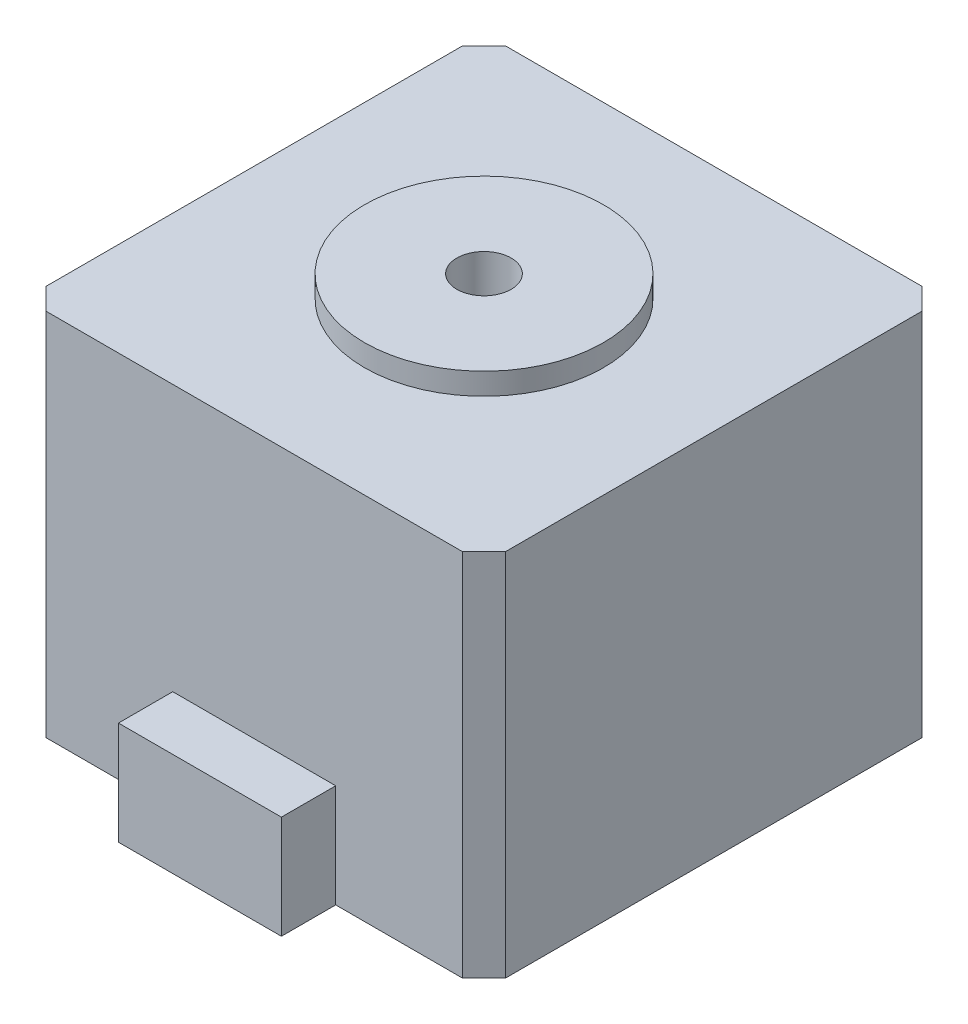
ISO-10303-21;
HEADER;
FILE_DESCRIPTION(('STEP AP214'),'2;1');
FILE_NAME('part.step','',(''),(''),'','','');
FILE_SCHEMA(('AUTOMOTIVE_DESIGN { 1 0 10303 214 1 1 1 1 }'));
ENDSEC;
DATA;
#1=APPLICATION_CONTEXT('core data for automotive mechanical design processes');
#2=APPLICATION_PROTOCOL_DEFINITION('international standard','automotive_design',2000,#1);
#3=PRODUCT_CONTEXT('',#1,'mechanical');
#4=PRODUCT('Part','Part','',(#3));
#5=PRODUCT_RELATED_PRODUCT_CATEGORY('part','',(#4));
#6=PRODUCT_DEFINITION_FORMATION('','',#4);
#7=PRODUCT_DEFINITION_CONTEXT('part definition',#1,'design');
#8=PRODUCT_DEFINITION('design','',#6,#7);
#9=PRODUCT_DEFINITION_SHAPE('','',#8);
#10=(LENGTH_UNIT() NAMED_UNIT(*) SI_UNIT(.MILLI.,.METRE.));
#11=(NAMED_UNIT(*) PLANE_ANGLE_UNIT() SI_UNIT($,.RADIAN.));
#12=(NAMED_UNIT(*) SI_UNIT($,.STERADIAN.) SOLID_ANGLE_UNIT());
#13=UNCERTAINTY_MEASURE_WITH_UNIT(LENGTH_MEASURE(1.E-05),#10,'distance_accuracy_value','');
#14=(GEOMETRIC_REPRESENTATION_CONTEXT(3) GLOBAL_UNCERTAINTY_ASSIGNED_CONTEXT((#13)) GLOBAL_UNIT_ASSIGNED_CONTEXT((#10,
#11,#12)) REPRESENTATION_CONTEXT('',''));
#15=CARTESIAN_POINT('',(0.,0.,0.));
#16=DIRECTION('',(0.,0.,1.));
#17=DIRECTION('',(1.,0.,0.));
#18=AXIS2_PLACEMENT_3D('',#15,#16,#17);
#19=CARTESIAN_POINT('',(0.,34.,0.));
#20=DIRECTION('',(0.,0.,-1.));
#21=DIRECTION('',(-1.,0.,0.));
#22=AXIS2_PLACEMENT_3D('',#19,#20,#21);
#23=PLANE('',#22);
#24=DIRECTION('',(0.,-1.,0.));
#25=VECTOR('',#24,1.);
#26=CARTESIAN_POINT('',(13.65,0.,0.));
#27=LINE('',#26,#25);
#28=CARTESIAN_POINT('',(13.65,9.5,0.));
#29=VERTEX_POINT('',#28);
#30=CARTESIAN_POINT('',(13.65,0.,0.));
#31=VERTEX_POINT('',#30);
#32=EDGE_CURVE('E65',#29,#31,#27,.T.);
#33=ORIENTED_EDGE('',*,*,#32,.F.);
#34=DIRECTION('',(-1.,0.,0.));
#35=VECTOR('',#34,1.);
#36=CARTESIAN_POINT('',(13.65,9.5,0.));
#37=LINE('',#36,#35);
#38=CARTESIAN_POINT('',(28.65,9.5,0.));
#39=VERTEX_POINT('',#38);
#40=EDGE_CURVE('E161',#39,#29,#37,.T.);
#41=ORIENTED_EDGE('',*,*,#40,.F.);
#42=DIRECTION('',(0.,1.,0.));
#43=VECTOR('',#42,1.);
#44=CARTESIAN_POINT('',(28.65,0.,0.));
#45=LINE('',#44,#43);
#46=CARTESIAN_POINT('',(28.65,0.,0.));
#47=VERTEX_POINT('',#46);
#48=EDGE_CURVE('E71',#47,#39,#45,.T.);
#49=ORIENTED_EDGE('',*,*,#48,.F.);
#50=DIRECTION('',(1.,0.,0.));
#51=VECTOR('',#50,1.);
#52=CARTESIAN_POINT('',(0.,0.,0.));
#53=LINE('',#52,#51);
#54=CARTESIAN_POINT('',(40.3,0.,0.));
#55=VERTEX_POINT('',#54);
#56=EDGE_CURVE('E205',#47,#55,#53,.T.);
#57=ORIENTED_EDGE('',*,*,#56,.T.);
#58=DIRECTION('',(0.,1.,0.));
#59=VECTOR('',#58,1.);
#60=CARTESIAN_POINT('',(40.3,34.,0.));
#61=LINE('',#60,#59);
#62=CARTESIAN_POINT('',(40.3,34.,0.));
#63=VERTEX_POINT('',#62);
#64=EDGE_CURVE('E260',#55,#63,#61,.T.);
#65=ORIENTED_EDGE('',*,*,#64,.T.);
#66=DIRECTION('',(1.,0.,0.));
#67=VECTOR('',#66,1.);
#68=CARTESIAN_POINT('',(0.,34.,0.));
#69=LINE('',#68,#67);
#70=CARTESIAN_POINT('',(1.99999999999999,34.,0.));
#71=VERTEX_POINT('',#70);
#72=EDGE_CURVE('E188',#71,#63,#69,.T.);
#73=ORIENTED_EDGE('',*,*,#72,.F.);
#74=DIRECTION('',(0.,-1.,0.));
#75=VECTOR('',#74,1.);
#76=CARTESIAN_POINT('',(1.99999999999999,34.,0.));
#77=LINE('',#76,#75);
#78=CARTESIAN_POINT('',(1.99999999999999,0.,0.));
#79=VERTEX_POINT('',#78);
#80=EDGE_CURVE('E52',#71,#79,#77,.T.);
#81=ORIENTED_EDGE('',*,*,#80,.T.);
#82=EDGE_CURVE('E206',#79,#31,#53,.T.);
#83=ORIENTED_EDGE('',*,*,#82,.T.);
#84=EDGE_LOOP('',(#33,#41,#49,#57,#65,#73,#81,#83));
#85=FACE_BOUND('',#84,.T.);
#86=ADVANCED_FACE('F47',(#85),#23,.F.);
#87=CARTESIAN_POINT('',(0.,34.,0.));
#88=DIRECTION('',(1.,0.,0.));
#89=DIRECTION('',(0.,0.,-1.));
#90=AXIS2_PLACEMENT_3D('',#87,#88,#89);
#91=PLANE('',#90);
#92=DIRECTION('',(0.,0.,1.));
#93=VECTOR('',#92,1.);
#94=CARTESIAN_POINT('',(0.,34.,0.));
#95=LINE('',#94,#93);
#96=CARTESIAN_POINT('',(0.,34.,-40.3));
#97=VERTEX_POINT('',#96);
#98=CARTESIAN_POINT('',(0.,34.,-2.));
#99=VERTEX_POINT('',#98);
#100=EDGE_CURVE('E184',#97,#99,#95,.T.);
#101=ORIENTED_EDGE('',*,*,#100,.F.);
#102=DIRECTION('',(0.,-1.,0.));
#103=VECTOR('',#102,1.);
#104=CARTESIAN_POINT('',(0.,34.,-40.3));
#105=LINE('',#104,#103);
#106=CARTESIAN_POINT('',(0.,0.,-40.3));
#107=VERTEX_POINT('',#106);
#108=EDGE_CURVE('E257',#97,#107,#105,.T.);
#109=ORIENTED_EDGE('',*,*,#108,.T.);
#110=DIRECTION('',(0.,0.,1.));
#111=VECTOR('',#110,1.);
#112=CARTESIAN_POINT('',(0.,0.,0.));
#113=LINE('',#112,#111);
#114=CARTESIAN_POINT('',(0.,0.,-2.));
#115=VERTEX_POINT('',#114);
#116=EDGE_CURVE('E182',#107,#115,#113,.T.);
#117=ORIENTED_EDGE('',*,*,#116,.T.);
#118=DIRECTION('',(0.,1.,0.));
#119=VECTOR('',#118,1.);
#120=CARTESIAN_POINT('',(0.,34.,-2.));
#121=LINE('',#120,#119);
#122=EDGE_CURVE('E254',#115,#99,#121,.T.);
#123=ORIENTED_EDGE('',*,*,#122,.T.);
#124=EDGE_LOOP('',(#101,#109,#117,#123));
#125=FACE_BOUND('',#124,.T.);
#126=ADVANCED_FACE('F273',(#125),#91,.F.);
#127=CARTESIAN_POINT('',(42.3,34.,0.));
#128=DIRECTION('',(-1.,0.,0.));
#129=DIRECTION('',(0.,0.,1.));
#130=AXIS2_PLACEMENT_3D('',#127,#128,#129);
#131=PLANE('',#130);
#132=DIRECTION('',(0.,0.,-1.));
#133=VECTOR('',#132,1.);
#134=CARTESIAN_POINT('',(42.3,0.,0.));
#135=LINE('',#134,#133);
#136=CARTESIAN_POINT('',(42.3,0.,-1.99999999999999));
#137=VERTEX_POINT('',#136);
#138=CARTESIAN_POINT('',(42.3,0.,-40.3));
#139=VERTEX_POINT('',#138);
#140=EDGE_CURVE('E209',#137,#139,#135,.T.);
#141=ORIENTED_EDGE('',*,*,#140,.T.);
#142=DIRECTION('',(0.,1.,0.));
#143=VECTOR('',#142,1.);
#144=CARTESIAN_POINT('',(42.3,34.,-40.3));
#145=LINE('',#144,#143);
#146=CARTESIAN_POINT('',(42.3,34.,-40.3));
#147=VERTEX_POINT('',#146);
#148=EDGE_CURVE('E239',#139,#147,#145,.T.);
#149=ORIENTED_EDGE('',*,*,#148,.T.);
#150=DIRECTION('',(0.,0.,-1.));
#151=VECTOR('',#150,1.);
#152=CARTESIAN_POINT('',(42.3,34.,0.));
#153=LINE('',#152,#151);
#154=CARTESIAN_POINT('',(42.3,34.,-1.99999999999999));
#155=VERTEX_POINT('',#154);
#156=EDGE_CURVE('E193',#155,#147,#153,.T.);
#157=ORIENTED_EDGE('',*,*,#156,.F.);
#158=DIRECTION('',(0.,-1.,0.));
#159=VECTOR('',#158,1.);
#160=CARTESIAN_POINT('',(42.3,34.,-1.99999999999999));
#161=LINE('',#160,#159);
#162=EDGE_CURVE('E235',#155,#137,#161,.T.);
#163=ORIENTED_EDGE('',*,*,#162,.T.);
#164=EDGE_LOOP('',(#141,#149,#157,#163));
#165=FACE_BOUND('',#164,.T.);
#166=ADVANCED_FACE('F293',(#165),#131,.F.);
#167=CARTESIAN_POINT('',(0.,34.,-42.3));
#168=DIRECTION('',(0.,0.,1.));
#169=DIRECTION('',(1.,0.,0.));
#170=AXIS2_PLACEMENT_3D('',#167,#168,#169);
#171=PLANE('',#170);
#172=DIRECTION('',(-1.,0.,0.));
#173=VECTOR('',#172,1.);
#174=CARTESIAN_POINT('',(0.,34.,-42.3));
#175=LINE('',#174,#173);
#176=CARTESIAN_POINT('',(40.3,34.,-42.3));
#177=VERTEX_POINT('',#176);
#178=CARTESIAN_POINT('',(2.,34.,-42.3));
#179=VERTEX_POINT('',#178);
#180=EDGE_CURVE('E197',#177,#179,#175,.T.);
#181=ORIENTED_EDGE('',*,*,#180,.F.);
#182=DIRECTION('',(0.,-1.,0.));
#183=VECTOR('',#182,1.);
#184=CARTESIAN_POINT('',(40.3,34.,-42.3));
#185=LINE('',#184,#183);
#186=CARTESIAN_POINT('',(40.3,0.,-42.3));
#187=VERTEX_POINT('',#186);
#188=EDGE_CURVE('E218',#177,#187,#185,.T.);
#189=ORIENTED_EDGE('',*,*,#188,.T.);
#190=DIRECTION('',(-1.,0.,0.));
#191=VECTOR('',#190,1.);
#192=CARTESIAN_POINT('',(0.,0.,-42.3));
#193=LINE('',#192,#191);
#194=CARTESIAN_POINT('',(2.,0.,-42.3));
#195=VERTEX_POINT('',#194);
#196=EDGE_CURVE('E189',#187,#195,#193,.T.);
#197=ORIENTED_EDGE('',*,*,#196,.T.);
#198=DIRECTION('',(0.,1.,0.));
#199=VECTOR('',#198,1.);
#200=CARTESIAN_POINT('',(2.,34.,-42.3));
#201=LINE('',#200,#199);
#202=EDGE_CURVE('E201',#195,#179,#201,.T.);
#203=ORIENTED_EDGE('',*,*,#202,.T.);
#204=EDGE_LOOP('',(#181,#189,#197,#203));
#205=FACE_BOUND('',#204,.T.);
#206=ADVANCED_FACE('F285',(#205),#171,.F.);
#207=CARTESIAN_POINT('',(0.,34.,0.));
#208=DIRECTION('',(0.,-1.,0.));
#209=DIRECTION('',(0.,0.,-1.));
#210=AXIS2_PLACEMENT_3D('',#207,#208,#209);
#211=PLANE('',#210);
#212=CARTESIAN_POINT('',(21.15,34.,-21.15));
#213=DIRECTION('',(0.,1.,0.));
#214=DIRECTION('',(0.,0.,1.));
#215=AXIS2_PLACEMENT_3D('',#212,#213,#214);
#216=CIRCLE('',#215,11.);
#217=CARTESIAN_POINT('',(21.15,34.,-10.15));
#218=VERTEX_POINT('',#217);
#219=EDGE_CURVE('E11',#218,#218,#216,.T.);
#220=ORIENTED_EDGE('',*,*,#219,.F.);
#221=EDGE_LOOP('',(#220));
#222=FACE_BOUND('',#221,.T.);
#223=ORIENTED_EDGE('',*,*,#156,.T.);
#224=DIRECTION('',(0.707106781186546,0.,0.707106781186549));
#225=VECTOR('',#224,1.);
#226=CARTESIAN_POINT('',(40.3,34.,-42.3));
#227=LINE('',#226,#225);
#228=EDGE_CURVE('E251',#147,#177,#227,.F.);
#229=ORIENTED_EDGE('',*,*,#228,.T.);
#230=ORIENTED_EDGE('',*,*,#180,.T.);
#231=DIRECTION('',(0.707106781186549,0.,-0.707106781186546));
#232=VECTOR('',#231,1.);
#233=CARTESIAN_POINT('',(0.,34.,-40.3));
#234=LINE('',#233,#232);
#235=EDGE_CURVE('E248',#179,#97,#234,.F.);
#236=ORIENTED_EDGE('',*,*,#235,.T.);
#237=ORIENTED_EDGE('',*,*,#100,.T.);
#238=DIRECTION('',(-0.707106781186546,0.,-0.707106781186549));
#239=VECTOR('',#238,1.);
#240=CARTESIAN_POINT('',(1.99999999999999,34.,0.));
#241=LINE('',#240,#239);
#242=EDGE_CURVE('E245',#99,#71,#241,.F.);
#243=ORIENTED_EDGE('',*,*,#242,.T.);
#244=ORIENTED_EDGE('',*,*,#72,.T.);
#245=DIRECTION('',(-0.707106781186549,0.,0.707106781186546));
#246=VECTOR('',#245,1.);
#247=CARTESIAN_POINT('',(42.3,34.,-1.99999999999999));
#248=LINE('',#247,#246);
#249=EDGE_CURVE('E242',#63,#155,#248,.F.);
#250=ORIENTED_EDGE('',*,*,#249,.T.);
#251=EDGE_LOOP('',(#223,#229,#230,#236,#237,#243,#244,#250));
#252=FACE_BOUND('',#251,.T.);
#253=ADVANCED_FACE('F277',(#222,#252),#211,.F.);
#254=CARTESIAN_POINT('',(0.,0.,0.));
#255=DIRECTION('',(0.,-1.,0.));
#256=DIRECTION('',(0.,0.,-1.));
#257=AXIS2_PLACEMENT_3D('',#254,#255,#256);
#258=PLANE('',#257);
#259=ORIENTED_EDGE('',*,*,#196,.F.);
#260=DIRECTION('',(-0.707106781186546,0.,-0.707106781186549));
#261=VECTOR('',#260,1.);
#262=CARTESIAN_POINT('',(41.3000000000001,0.,-41.2999999999999));
#263=LINE('',#262,#261);
#264=EDGE_CURVE('E232',#187,#139,#263,.F.);
#265=ORIENTED_EDGE('',*,*,#264,.T.);
#266=ORIENTED_EDGE('',*,*,#140,.F.);
#267=DIRECTION('',(0.707106781186549,0.,-0.707106781186546));
#268=VECTOR('',#267,1.);
#269=CARTESIAN_POINT('',(20.1499999999999,0.,20.15));
#270=LINE('',#269,#268);
#271=EDGE_CURVE('E222',#137,#55,#270,.F.);
#272=ORIENTED_EDGE('',*,*,#271,.T.);
#273=ORIENTED_EDGE('',*,*,#56,.F.);
#274=DIRECTION('',(0.,0.,-1.));
#275=VECTOR('',#274,1.);
#276=CARTESIAN_POINT('',(28.65,0.,5.));
#277=LINE('',#276,#275);
#278=CARTESIAN_POINT('',(28.65,0.,5.));
#279=VERTEX_POINT('',#278);
#280=EDGE_CURVE('E146',#279,#47,#277,.T.);
#281=ORIENTED_EDGE('',*,*,#280,.F.);
#282=DIRECTION('',(1.,0.,0.));
#283=VECTOR('',#282,1.);
#284=CARTESIAN_POINT('',(13.65,0.,5.));
#285=LINE('',#284,#283);
#286=CARTESIAN_POINT('',(13.65,0.,5.));
#287=VERTEX_POINT('',#286);
#288=EDGE_CURVE('E138',#287,#279,#285,.T.);
#289=ORIENTED_EDGE('',*,*,#288,.F.);
#290=DIRECTION('',(0.,0.,-1.));
#291=VECTOR('',#290,1.);
#292=CARTESIAN_POINT('',(13.65,0.,5.));
#293=LINE('',#292,#291);
#294=EDGE_CURVE('E144',#287,#31,#293,.T.);
#295=ORIENTED_EDGE('',*,*,#294,.T.);
#296=ORIENTED_EDGE('',*,*,#82,.F.);
#297=DIRECTION('',(0.707106781186546,0.,0.707106781186549));
#298=VECTOR('',#297,1.);
#299=CARTESIAN_POINT('',(1.,0.,-0.999999999999997));
#300=LINE('',#299,#298);
#301=EDGE_CURVE('E226',#79,#115,#300,.F.);
#302=ORIENTED_EDGE('',*,*,#301,.T.);
#303=ORIENTED_EDGE('',*,*,#116,.F.);
#304=DIRECTION('',(-0.707106781186549,0.,0.707106781186546));
#305=VECTOR('',#304,1.);
#306=CARTESIAN_POINT('',(-20.15,0.,-20.1500000000001));
#307=LINE('',#306,#305);
#308=EDGE_CURVE('E229',#107,#195,#307,.F.);
#309=ORIENTED_EDGE('',*,*,#308,.T.);
#310=EDGE_LOOP('',(#259,#265,#266,#272,#273,#281,#289,#295,#296,#302,#303,#309));
#311=FACE_BOUND('',#310,.T.);
#312=ADVANCED_FACE('F141',(#311),#258,.T.);
#313=CARTESIAN_POINT('',(40.3,34.,-42.3));
#314=DIRECTION('',(-0.707106781186549,0.,0.707106781186546));
#315=DIRECTION('',(0.,-1.,0.));
#316=AXIS2_PLACEMENT_3D('',#313,#314,#315);
#317=PLANE('',#316);
#318=ORIENTED_EDGE('',*,*,#228,.F.);
#319=ORIENTED_EDGE('',*,*,#148,.F.);
#320=ORIENTED_EDGE('',*,*,#264,.F.);
#321=ORIENTED_EDGE('',*,*,#188,.F.);
#322=EDGE_LOOP('',(#318,#319,#320,#321));
#323=FACE_BOUND('',#322,.T.);
#324=ADVANCED_FACE('F289',(#323),#317,.F.);
#325=CARTESIAN_POINT('',(0.,34.,-40.3));
#326=DIRECTION('',(0.707106781186546,0.,0.707106781186549));
#327=DIRECTION('',(0.,-1.,0.));
#328=AXIS2_PLACEMENT_3D('',#325,#326,#327);
#329=PLANE('',#328);
#330=ORIENTED_EDGE('',*,*,#235,.F.);
#331=ORIENTED_EDGE('',*,*,#202,.F.);
#332=ORIENTED_EDGE('',*,*,#308,.F.);
#333=ORIENTED_EDGE('',*,*,#108,.F.);
#334=EDGE_LOOP('',(#330,#331,#332,#333));
#335=FACE_BOUND('',#334,.T.);
#336=ADVANCED_FACE('F281',(#335),#329,.F.);
#337=CARTESIAN_POINT('',(1.99999999999999,34.,0.));
#338=DIRECTION('',(0.707106781186549,0.,-0.707106781186546));
#339=DIRECTION('',(0.,-1.,0.));
#340=AXIS2_PLACEMENT_3D('',#337,#338,#339);
#341=PLANE('',#340);
#342=ORIENTED_EDGE('',*,*,#242,.F.);
#343=ORIENTED_EDGE('',*,*,#122,.F.);
#344=ORIENTED_EDGE('',*,*,#301,.F.);
#345=ORIENTED_EDGE('',*,*,#80,.F.);
#346=EDGE_LOOP('',(#342,#343,#344,#345));
#347=FACE_BOUND('',#346,.T.);
#348=ADVANCED_FACE('F275',(#347),#341,.F.);
#349=CARTESIAN_POINT('',(42.3,34.,-1.99999999999999));
#350=DIRECTION('',(-0.707106781186546,0.,-0.707106781186549));
#351=DIRECTION('',(0.,-1.,0.));
#352=AXIS2_PLACEMENT_3D('',#349,#350,#351);
#353=PLANE('',#352);
#354=ORIENTED_EDGE('',*,*,#249,.F.);
#355=ORIENTED_EDGE('',*,*,#64,.F.);
#356=ORIENTED_EDGE('',*,*,#271,.F.);
#357=ORIENTED_EDGE('',*,*,#162,.F.);
#358=EDGE_LOOP('',(#354,#355,#356,#357));
#359=FACE_BOUND('',#358,.T.);
#360=ADVANCED_FACE('F50',(#359),#353,.F.);
#361=CARTESIAN_POINT('',(21.15,36.,-21.15));
#362=DIRECTION('',(0.,-1.,0.));
#363=DIRECTION('',(0.,0.,-1.));
#364=AXIS2_PLACEMENT_3D('',#361,#362,#363);
#365=CYLINDRICAL_SURFACE('',#364,11.);
#366=CARTESIAN_POINT('',(21.15,36.,-21.15));
#367=DIRECTION('',(0.,1.,0.));
#368=DIRECTION('',(0.,0.,1.));
#369=AXIS2_PLACEMENT_3D('',#366,#367,#368);
#370=CIRCLE('',#369,11.);
#371=CARTESIAN_POINT('',(21.15,36.,-10.15));
#372=VERTEX_POINT('',#371);
#373=EDGE_CURVE('E178',#372,#372,#370,.T.);
#374=ORIENTED_EDGE('',*,*,#373,.F.);
#375=EDGE_LOOP('',(#374));
#376=FACE_BOUND('',#375,.T.);
#377=ORIENTED_EDGE('',*,*,#219,.T.);
#378=EDGE_LOOP('',(#377));
#379=FACE_BOUND('',#378,.T.);
#380=ADVANCED_FACE('F353',(#376,#379),#365,.T.);
#381=CARTESIAN_POINT('',(21.15,36.,-21.15));
#382=DIRECTION('',(0.,1.,0.));
#383=DIRECTION('',(0.,0.,1.));
#384=AXIS2_PLACEMENT_3D('',#381,#382,#383);
#385=PLANE('',#384);
#386=CARTESIAN_POINT('',(21.15,36.,-21.15));
#387=DIRECTION('',(0.,1.,0.));
#388=DIRECTION('',(0.,0.,1.));
#389=AXIS2_PLACEMENT_3D('',#386,#387,#388);
#390=CIRCLE('',#389,2.5);
#391=CARTESIAN_POINT('',(21.15,36.,-18.65));
#392=VERTEX_POINT('',#391);
#393=EDGE_CURVE('E165',#392,#392,#390,.T.);
#394=ORIENTED_EDGE('',*,*,#393,.F.);
#395=EDGE_LOOP('',(#394));
#396=FACE_BOUND('',#395,.T.);
#397=ORIENTED_EDGE('',*,*,#373,.T.);
#398=EDGE_LOOP('',(#397));
#399=FACE_BOUND('',#398,.T.);
#400=ADVANCED_FACE('F358',(#396,#399),#385,.T.);
#401=CARTESIAN_POINT('',(21.15,16.,-21.15));
#402=DIRECTION('',(0.,1.,0.));
#403=DIRECTION('',(0.,0.,1.));
#404=AXIS2_PLACEMENT_3D('',#401,#402,#403);
#405=CYLINDRICAL_SURFACE('',#404,2.5);
#406=CARTESIAN_POINT('',(21.15,16.,-21.15));
#407=DIRECTION('',(0.,1.,0.));
#408=DIRECTION('',(0.,0.,1.));
#409=AXIS2_PLACEMENT_3D('',#406,#407,#408);
#410=CIRCLE('',#409,2.5);
#411=CARTESIAN_POINT('',(21.15,16.,-18.65));
#412=VERTEX_POINT('',#411);
#413=EDGE_CURVE('E170',#412,#412,#410,.T.);
#414=ORIENTED_EDGE('',*,*,#413,.F.);
#415=EDGE_LOOP('',(#414));
#416=FACE_BOUND('',#415,.T.);
#417=ORIENTED_EDGE('',*,*,#393,.T.);
#418=EDGE_LOOP('',(#417));
#419=FACE_BOUND('',#418,.T.);
#420=ADVANCED_FACE('F364',(#416,#419),#405,.F.);
#421=CARTESIAN_POINT('',(21.15,16.,-21.15));
#422=DIRECTION('',(0.,1.,0.));
#423=DIRECTION('',(0.,0.,1.));
#424=AXIS2_PLACEMENT_3D('',#421,#422,#423);
#425=PLANE('',#424);
#426=ORIENTED_EDGE('',*,*,#413,.T.);
#427=EDGE_LOOP('',(#426));
#428=FACE_BOUND('',#427,.T.);
#429=ADVANCED_FACE('F436',(#428),#425,.T.);
#430=CARTESIAN_POINT('',(13.65,0.,5.));
#431=DIRECTION('',(1.,0.,0.));
#432=DIRECTION('',(0.,0.,-1.));
#433=AXIS2_PLACEMENT_3D('',#430,#431,#432);
#434=PLANE('',#433);
#435=ORIENTED_EDGE('',*,*,#32,.T.);
#436=ORIENTED_EDGE('',*,*,#294,.F.);
#437=DIRECTION('',(0.,-1.,0.));
#438=VECTOR('',#437,1.);
#439=CARTESIAN_POINT('',(13.65,0.,5.));
#440=LINE('',#439,#438);
#441=CARTESIAN_POINT('',(13.65,9.5,5.));
#442=VERTEX_POINT('',#441);
#443=EDGE_CURVE('E151',#442,#287,#440,.T.);
#444=ORIENTED_EDGE('',*,*,#443,.F.);
#445=DIRECTION('',(0.,0.,-1.));
#446=VECTOR('',#445,1.);
#447=CARTESIAN_POINT('',(13.65,9.5,5.));
#448=LINE('',#447,#446);
#449=EDGE_CURVE('E305',#442,#29,#448,.T.);
#450=ORIENTED_EDGE('',*,*,#449,.T.);
#451=EDGE_LOOP('',(#435,#436,#444,#450));
#452=FACE_BOUND('',#451,.T.);
#453=ADVANCED_FACE('F163',(#452),#434,.F.);
#454=CARTESIAN_POINT('',(28.65,0.,5.));
#455=DIRECTION('',(-1.,0.,0.));
#456=DIRECTION('',(0.,0.,1.));
#457=AXIS2_PLACEMENT_3D('',#454,#455,#456);
#458=PLANE('',#457);
#459=ORIENTED_EDGE('',*,*,#48,.T.);
#460=DIRECTION('',(0.,0.,-1.));
#461=VECTOR('',#460,1.);
#462=CARTESIAN_POINT('',(28.65,9.5,5.));
#463=LINE('',#462,#461);
#464=CARTESIAN_POINT('',(28.65,9.5,5.));
#465=VERTEX_POINT('',#464);
#466=EDGE_CURVE('E172',#465,#39,#463,.T.);
#467=ORIENTED_EDGE('',*,*,#466,.F.);
#468=DIRECTION('',(0.,1.,0.));
#469=VECTOR('',#468,1.);
#470=CARTESIAN_POINT('',(28.65,0.,5.));
#471=LINE('',#470,#469);
#472=EDGE_CURVE('E150',#279,#465,#471,.T.);
#473=ORIENTED_EDGE('',*,*,#472,.F.);
#474=ORIENTED_EDGE('',*,*,#280,.T.);
#475=EDGE_LOOP('',(#459,#467,#473,#474));
#476=FACE_BOUND('',#475,.T.);
#477=ADVANCED_FACE('F299',(#476),#458,.F.);
#478=CARTESIAN_POINT('',(13.65,9.5,5.));
#479=DIRECTION('',(0.,-1.,0.));
#480=DIRECTION('',(0.,0.,-1.));
#481=AXIS2_PLACEMENT_3D('',#478,#479,#480);
#482=PLANE('',#481);
#483=ORIENTED_EDGE('',*,*,#40,.T.);
#484=ORIENTED_EDGE('',*,*,#449,.F.);
#485=DIRECTION('',(-1.,0.,0.));
#486=VECTOR('',#485,1.);
#487=CARTESIAN_POINT('',(13.65,9.5,5.));
#488=LINE('',#487,#486);
#489=EDGE_CURVE('E156',#465,#442,#488,.T.);
#490=ORIENTED_EDGE('',*,*,#489,.F.);
#491=ORIENTED_EDGE('',*,*,#466,.T.);
#492=EDGE_LOOP('',(#483,#484,#490,#491));
#493=FACE_BOUND('',#492,.T.);
#494=ADVANCED_FACE('F317',(#493),#482,.F.);
#495=CARTESIAN_POINT('',(0.,0.,5.));
#496=DIRECTION('',(0.,0.,-1.));
#497=DIRECTION('',(-1.,0.,0.));
#498=AXIS2_PLACEMENT_3D('',#495,#496,#497);
#499=PLANE('',#498);
#500=ORIENTED_EDGE('',*,*,#443,.T.);
#501=ORIENTED_EDGE('',*,*,#288,.T.);
#502=ORIENTED_EDGE('',*,*,#472,.T.);
#503=ORIENTED_EDGE('',*,*,#489,.T.);
#504=EDGE_LOOP('',(#500,#501,#502,#503));
#505=FACE_BOUND('',#504,.T.);
#506=ADVANCED_FACE('F154',(#505),#499,.F.);
#507=CLOSED_SHELL('',(#86,#126,#166,#206,#253,#312,#324,#336,#348,#360,#380,#400,#420,#429,#453,
#477,#494,#506));
#508=MANIFOLD_SOLID_BREP('B2',#507);
#509=ADVANCED_BREP_SHAPE_REPRESENTATION('',(#18,#508),#14);
#510=SHAPE_DEFINITION_REPRESENTATION(#9,#509);
ENDSEC;
END-ISO-10303-21;
